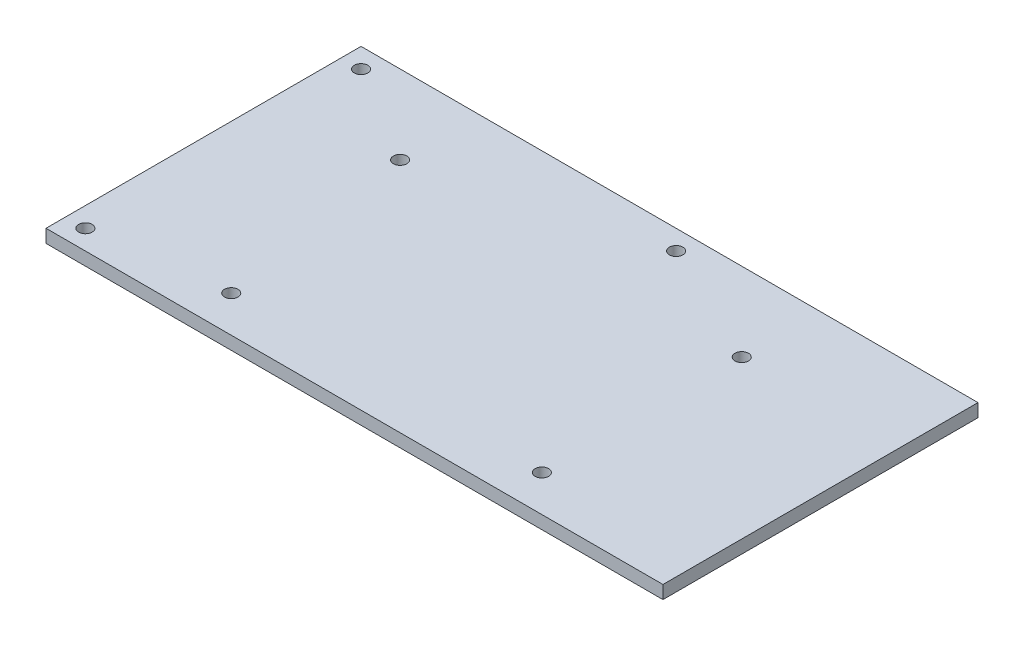
ISO-10303-21;
HEADER;
FILE_DESCRIPTION(('STEP AP214'),'2;1');
FILE_NAME('part.step','',(''),(''),'','','');
FILE_SCHEMA(('AUTOMOTIVE_DESIGN { 1 0 10303 214 1 1 1 1 }'));
ENDSEC;
DATA;
#1=APPLICATION_CONTEXT('core data for automotive mechanical design processes');
#2=APPLICATION_PROTOCOL_DEFINITION('international standard','automotive_design',2000,#1);
#3=PRODUCT_CONTEXT('',#1,'mechanical');
#4=PRODUCT('Part','Part','',(#3));
#5=PRODUCT_RELATED_PRODUCT_CATEGORY('part','',(#4));
#6=PRODUCT_DEFINITION_FORMATION('','',#4);
#7=PRODUCT_DEFINITION_CONTEXT('part definition',#1,'design');
#8=PRODUCT_DEFINITION('design','',#6,#7);
#9=PRODUCT_DEFINITION_SHAPE('','',#8);
#10=(LENGTH_UNIT() NAMED_UNIT(*) SI_UNIT(.MILLI.,.METRE.));
#11=(NAMED_UNIT(*) PLANE_ANGLE_UNIT() SI_UNIT($,.RADIAN.));
#12=(NAMED_UNIT(*) SI_UNIT($,.STERADIAN.) SOLID_ANGLE_UNIT());
#13=UNCERTAINTY_MEASURE_WITH_UNIT(LENGTH_MEASURE(1.E-05),#10,'distance_accuracy_value','');
#14=(GEOMETRIC_REPRESENTATION_CONTEXT(3) GLOBAL_UNCERTAINTY_ASSIGNED_CONTEXT((#13)) GLOBAL_UNIT_ASSIGNED_CONTEXT((#10,
#11,#12)) REPRESENTATION_CONTEXT('',''));
#15=CARTESIAN_POINT('',(0.,0.,0.));
#16=DIRECTION('',(0.,0.,1.));
#17=DIRECTION('',(1.,0.,0.));
#18=AXIS2_PLACEMENT_3D('',#15,#16,#17);
#19=CARTESIAN_POINT('',(74.6125,3.175,38.1));
#20=DIRECTION('',(-1.,0.,0.));
#21=DIRECTION('',(0.,0.,1.));
#22=AXIS2_PLACEMENT_3D('',#19,#20,#21);
#23=PLANE('',#22);
#24=DIRECTION('',(0.,0.,-1.));
#25=VECTOR('',#24,1.);
#26=CARTESIAN_POINT('',(74.6125,0.,38.1));
#27=LINE('',#26,#25);
#28=CARTESIAN_POINT('',(74.6125,0.,38.1));
#29=VERTEX_POINT('',#28);
#30=CARTESIAN_POINT('',(74.6125,0.,-38.1));
#31=VERTEX_POINT('',#30);
#32=EDGE_CURVE('E96',#29,#31,#27,.T.);
#33=ORIENTED_EDGE('',*,*,#32,.T.);
#34=DIRECTION('',(0.,-1.,0.));
#35=VECTOR('',#34,1.);
#36=CARTESIAN_POINT('',(74.6125,3.175,-38.1));
#37=LINE('',#36,#35);
#38=CARTESIAN_POINT('',(74.6125,3.175,-38.1));
#39=VERTEX_POINT('',#38);
#40=EDGE_CURVE('E11',#39,#31,#37,.T.);
#41=ORIENTED_EDGE('',*,*,#40,.F.);
#42=DIRECTION('',(0.,0.,-1.));
#43=VECTOR('',#42,1.);
#44=CARTESIAN_POINT('',(74.6125,3.175,38.1));
#45=LINE('',#44,#43);
#46=CARTESIAN_POINT('',(74.6125,3.175,38.1));
#47=VERTEX_POINT('',#46);
#48=EDGE_CURVE('E84',#47,#39,#45,.T.);
#49=ORIENTED_EDGE('',*,*,#48,.F.);
#50=DIRECTION('',(0.,-1.,0.));
#51=VECTOR('',#50,1.);
#52=CARTESIAN_POINT('',(74.6125,3.175,38.1));
#53=LINE('',#52,#51);
#54=EDGE_CURVE('E92',#47,#29,#53,.T.);
#55=ORIENTED_EDGE('',*,*,#54,.T.);
#56=EDGE_LOOP('',(#33,#41,#49,#55));
#57=FACE_BOUND('',#56,.T.);
#58=ADVANCED_FACE('F33',(#57),#23,.F.);
#59=CARTESIAN_POINT('',(-74.6125,3.175,-38.1));
#60=DIRECTION('',(0.,0.,1.));
#61=DIRECTION('',(1.,0.,0.));
#62=AXIS2_PLACEMENT_3D('',#59,#60,#61);
#63=PLANE('',#62);
#64=DIRECTION('',(-1.,0.,0.));
#65=VECTOR('',#64,1.);
#66=CARTESIAN_POINT('',(-74.6125,0.,-38.1));
#67=LINE('',#66,#65);
#68=CARTESIAN_POINT('',(-74.6125,0.,-38.1));
#69=VERTEX_POINT('',#68);
#70=EDGE_CURVE('E88',#31,#69,#67,.T.);
#71=ORIENTED_EDGE('',*,*,#70,.T.);
#72=DIRECTION('',(0.,-1.,0.));
#73=VECTOR('',#72,1.);
#74=CARTESIAN_POINT('',(-74.6125,3.175,-38.1));
#75=LINE('',#74,#73);
#76=CARTESIAN_POINT('',(-74.6125,3.175,-38.1));
#77=VERTEX_POINT('',#76);
#78=EDGE_CURVE('E41',#77,#69,#75,.T.);
#79=ORIENTED_EDGE('',*,*,#78,.F.);
#80=DIRECTION('',(-1.,0.,0.));
#81=VECTOR('',#80,1.);
#82=CARTESIAN_POINT('',(-74.6125,3.175,-38.1));
#83=LINE('',#82,#81);
#84=EDGE_CURVE('E79',#39,#77,#83,.T.);
#85=ORIENTED_EDGE('',*,*,#84,.F.);
#86=ORIENTED_EDGE('',*,*,#40,.T.);
#87=EDGE_LOOP('',(#71,#79,#85,#86));
#88=FACE_BOUND('',#87,.T.);
#89=ADVANCED_FACE('F87',(#88),#63,.F.);
#90=CARTESIAN_POINT('',(-74.6125,3.175,38.1));
#91=DIRECTION('',(1.,0.,0.));
#92=DIRECTION('',(0.,0.,-1.));
#93=AXIS2_PLACEMENT_3D('',#90,#91,#92);
#94=PLANE('',#93);
#95=DIRECTION('',(0.,0.,1.));
#96=VECTOR('',#95,1.);
#97=CARTESIAN_POINT('',(-74.6125,0.,38.1));
#98=LINE('',#97,#96);
#99=CARTESIAN_POINT('',(-74.6125,0.,38.1));
#100=VERTEX_POINT('',#99);
#101=EDGE_CURVE('E66',#69,#100,#98,.T.);
#102=ORIENTED_EDGE('',*,*,#101,.T.);
#103=DIRECTION('',(0.,-1.,0.));
#104=VECTOR('',#103,1.);
#105=CARTESIAN_POINT('',(-74.6125,3.175,38.1));
#106=LINE('',#105,#104);
#107=CARTESIAN_POINT('',(-74.6125,3.175,38.1));
#108=VERTEX_POINT('',#107);
#109=EDGE_CURVE('E89',#108,#100,#106,.T.);
#110=ORIENTED_EDGE('',*,*,#109,.F.);
#111=DIRECTION('',(0.,0.,1.));
#112=VECTOR('',#111,1.);
#113=CARTESIAN_POINT('',(-74.6125,3.175,38.1));
#114=LINE('',#113,#112);
#115=EDGE_CURVE('E82',#77,#108,#114,.T.);
#116=ORIENTED_EDGE('',*,*,#115,.F.);
#117=ORIENTED_EDGE('',*,*,#78,.T.);
#118=EDGE_LOOP('',(#102,#110,#116,#117));
#119=FACE_BOUND('',#118,.T.);
#120=ADVANCED_FACE('F90',(#119),#94,.F.);
#121=CARTESIAN_POINT('',(-74.6125,3.175,38.1));
#122=DIRECTION('',(0.,0.,-1.));
#123=DIRECTION('',(-1.,0.,0.));
#124=AXIS2_PLACEMENT_3D('',#121,#122,#123);
#125=PLANE('',#124);
#126=DIRECTION('',(1.,0.,0.));
#127=VECTOR('',#126,1.);
#128=CARTESIAN_POINT('',(-74.6125,0.,38.1));
#129=LINE('',#128,#127);
#130=EDGE_CURVE('E72',#100,#29,#129,.T.);
#131=ORIENTED_EDGE('',*,*,#130,.T.);
#132=ORIENTED_EDGE('',*,*,#54,.F.);
#133=DIRECTION('',(1.,0.,0.));
#134=VECTOR('',#133,1.);
#135=CARTESIAN_POINT('',(-74.6125,3.175,38.1));
#136=LINE('',#135,#134);
#137=EDGE_CURVE('E49',#108,#47,#136,.T.);
#138=ORIENTED_EDGE('',*,*,#137,.F.);
#139=ORIENTED_EDGE('',*,*,#109,.T.);
#140=EDGE_LOOP('',(#131,#132,#138,#139));
#141=FACE_BOUND('',#140,.T.);
#142=ADVANCED_FACE('F104',(#141),#125,.F.);
#143=CARTESIAN_POINT('',(0.,3.175,0.));
#144=DIRECTION('',(0.,-1.,0.));
#145=DIRECTION('',(0.,0.,-1.));
#146=AXIS2_PLACEMENT_3D('',#143,#144,#145);
#147=PLANE('',#146);
#148=CARTESIAN_POINT('',(36.5125,3.175,29.2862));
#149=DIRECTION('',(0.,1.,0.));
#150=DIRECTION('',(0.,0.,1.));
#151=AXIS2_PLACEMENT_3D('',#148,#149,#150);
#152=CIRCLE('',#151,1.63195);
#153=CARTESIAN_POINT('',(36.5125,3.175,30.91815));
#154=VERTEX_POINT('',#153);
#155=EDGE_CURVE('E143',#154,#154,#152,.T.);
#156=ORIENTED_EDGE('',*,*,#155,.F.);
#157=EDGE_LOOP('',(#156));
#158=FACE_BOUND('',#157,.T.);
#159=CARTESIAN_POINT('',(36.5125,3.175,-19.05));
#160=DIRECTION('',(0.,1.,0.));
#161=DIRECTION('',(0.,0.,1.));
#162=AXIS2_PLACEMENT_3D('',#159,#160,#161);
#163=CIRCLE('',#162,1.63195);
#164=CARTESIAN_POINT('',(36.5125,3.175,-17.41805));
#165=VERTEX_POINT('',#164);
#166=EDGE_CURVE('E137',#165,#165,#163,.T.);
#167=ORIENTED_EDGE('',*,*,#166,.F.);
#168=EDGE_LOOP('',(#167));
#169=FACE_BOUND('',#168,.T.);
#170=CARTESIAN_POINT('',(-38.6207,3.175,29.2862));
#171=DIRECTION('',(0.,1.,0.));
#172=DIRECTION('',(0.,0.,1.));
#173=AXIS2_PLACEMENT_3D('',#170,#171,#172);
#174=CIRCLE('',#173,1.63195);
#175=CARTESIAN_POINT('',(-38.6207,3.175,30.91815));
#176=VERTEX_POINT('',#175);
#177=EDGE_CURVE('E131',#176,#176,#174,.T.);
#178=ORIENTED_EDGE('',*,*,#177,.F.);
#179=EDGE_LOOP('',(#178));
#180=FACE_BOUND('',#179,.T.);
#181=CARTESIAN_POINT('',(-46.1137,3.175,-19.05));
#182=DIRECTION('',(0.,1.,0.));
#183=DIRECTION('',(0.,0.,1.));
#184=AXIS2_PLACEMENT_3D('',#181,#182,#183);
#185=CIRCLE('',#184,1.63195);
#186=CARTESIAN_POINT('',(-46.1137,3.175,-17.41805));
#187=VERTEX_POINT('',#186);
#188=EDGE_CURVE('E125',#187,#187,#185,.T.);
#189=ORIENTED_EDGE('',*,*,#188,.F.);
#190=EDGE_LOOP('',(#189));
#191=FACE_BOUND('',#190,.T.);
#192=CARTESIAN_POINT('',(6.34999999999995,3.175,-33.3375));
#193=DIRECTION('',(0.,1.,0.));
#194=DIRECTION('',(0.,0.,1.));
#195=AXIS2_PLACEMENT_3D('',#192,#193,#194);
#196=CIRCLE('',#195,1.63195);
#197=CARTESIAN_POINT('',(6.34999999999995,3.175,-31.70555));
#198=VERTEX_POINT('',#197);
#199=EDGE_CURVE('E119',#198,#198,#196,.T.);
#200=ORIENTED_EDGE('',*,*,#199,.F.);
#201=EDGE_LOOP('',(#200));
#202=FACE_BOUND('',#201,.T.);
#203=CARTESIAN_POINT('',(-69.85,3.175,33.3375));
#204=DIRECTION('',(0.,1.,0.));
#205=DIRECTION('',(0.,0.,1.));
#206=AXIS2_PLACEMENT_3D('',#203,#204,#205);
#207=CIRCLE('',#206,1.63194999999999);
#208=CARTESIAN_POINT('',(-69.85,3.175,34.96945));
#209=VERTEX_POINT('',#208);
#210=EDGE_CURVE('E113',#209,#209,#207,.T.);
#211=ORIENTED_EDGE('',*,*,#210,.F.);
#212=EDGE_LOOP('',(#211));
#213=FACE_BOUND('',#212,.T.);
#214=CARTESIAN_POINT('',(-69.85,3.175,-33.3375));
#215=DIRECTION('',(0.,1.,0.));
#216=DIRECTION('',(0.,0.,1.));
#217=AXIS2_PLACEMENT_3D('',#214,#215,#216);
#218=CIRCLE('',#217,1.63194999999999);
#219=CARTESIAN_POINT('',(-69.85,3.175,-31.70555));
#220=VERTEX_POINT('',#219);
#221=EDGE_CURVE('E99',#220,#220,#218,.T.);
#222=ORIENTED_EDGE('',*,*,#221,.F.);
#223=EDGE_LOOP('',(#222));
#224=FACE_BOUND('',#223,.T.);
#225=ORIENTED_EDGE('',*,*,#48,.T.);
#226=ORIENTED_EDGE('',*,*,#84,.T.);
#227=ORIENTED_EDGE('',*,*,#115,.T.);
#228=ORIENTED_EDGE('',*,*,#137,.T.);
#229=EDGE_LOOP('',(#225,#226,#227,#228));
#230=FACE_BOUND('',#229,.T.);
#231=ADVANCED_FACE('F80',(#158,#169,#180,#191,#202,#213,#224,#230),#147,.F.);
#232=CARTESIAN_POINT('',(0.,0.,0.));
#233=DIRECTION('',(0.,-1.,0.));
#234=DIRECTION('',(0.,0.,-1.));
#235=AXIS2_PLACEMENT_3D('',#232,#233,#234);
#236=PLANE('',#235);
#237=CARTESIAN_POINT('',(36.5125,0.,29.2862));
#238=DIRECTION('',(0.,-1.,0.));
#239=DIRECTION('',(0.,0.,-1.));
#240=AXIS2_PLACEMENT_3D('',#237,#238,#239);
#241=CIRCLE('',#240,1.63195);
#242=CARTESIAN_POINT('',(36.5125,0.,27.65425));
#243=VERTEX_POINT('',#242);
#244=EDGE_CURVE('E146',#243,#243,#241,.F.);
#245=ORIENTED_EDGE('',*,*,#244,.T.);
#246=EDGE_LOOP('',(#245));
#247=FACE_BOUND('',#246,.T.);
#248=CARTESIAN_POINT('',(36.5125,0.,-19.05));
#249=DIRECTION('',(0.,-1.,0.));
#250=DIRECTION('',(0.,0.,-1.));
#251=AXIS2_PLACEMENT_3D('',#248,#249,#250);
#252=CIRCLE('',#251,1.63195);
#253=CARTESIAN_POINT('',(36.5125,0.,-20.68195));
#254=VERTEX_POINT('',#253);
#255=EDGE_CURVE('E140',#254,#254,#252,.F.);
#256=ORIENTED_EDGE('',*,*,#255,.T.);
#257=EDGE_LOOP('',(#256));
#258=FACE_BOUND('',#257,.T.);
#259=CARTESIAN_POINT('',(-38.6207,0.,29.2862));
#260=DIRECTION('',(0.,-1.,0.));
#261=DIRECTION('',(0.,0.,-1.));
#262=AXIS2_PLACEMENT_3D('',#259,#260,#261);
#263=CIRCLE('',#262,1.63195);
#264=CARTESIAN_POINT('',(-38.6207,0.,27.65425));
#265=VERTEX_POINT('',#264);
#266=EDGE_CURVE('E134',#265,#265,#263,.F.);
#267=ORIENTED_EDGE('',*,*,#266,.T.);
#268=EDGE_LOOP('',(#267));
#269=FACE_BOUND('',#268,.T.);
#270=CARTESIAN_POINT('',(-46.1137,0.,-19.05));
#271=DIRECTION('',(0.,-1.,0.));
#272=DIRECTION('',(0.,0.,-1.));
#273=AXIS2_PLACEMENT_3D('',#270,#271,#272);
#274=CIRCLE('',#273,1.63195);
#275=CARTESIAN_POINT('',(-46.1137,0.,-20.68195));
#276=VERTEX_POINT('',#275);
#277=EDGE_CURVE('E128',#276,#276,#274,.F.);
#278=ORIENTED_EDGE('',*,*,#277,.T.);
#279=EDGE_LOOP('',(#278));
#280=FACE_BOUND('',#279,.T.);
#281=CARTESIAN_POINT('',(6.34999999999995,0.,-33.3375));
#282=DIRECTION('',(0.,-1.,0.));
#283=DIRECTION('',(0.,0.,-1.));
#284=AXIS2_PLACEMENT_3D('',#281,#282,#283);
#285=CIRCLE('',#284,1.63195);
#286=CARTESIAN_POINT('',(6.34999999999995,0.,-34.96945));
#287=VERTEX_POINT('',#286);
#288=EDGE_CURVE('E122',#287,#287,#285,.F.);
#289=ORIENTED_EDGE('',*,*,#288,.T.);
#290=EDGE_LOOP('',(#289));
#291=FACE_BOUND('',#290,.T.);
#292=CARTESIAN_POINT('',(-69.85,0.,33.3375));
#293=DIRECTION('',(0.,-1.,0.));
#294=DIRECTION('',(0.,0.,-1.));
#295=AXIS2_PLACEMENT_3D('',#292,#293,#294);
#296=CIRCLE('',#295,1.63194999999999);
#297=CARTESIAN_POINT('',(-69.85,0.,31.70555));
#298=VERTEX_POINT('',#297);
#299=EDGE_CURVE('E116',#298,#298,#296,.F.);
#300=ORIENTED_EDGE('',*,*,#299,.T.);
#301=EDGE_LOOP('',(#300));
#302=FACE_BOUND('',#301,.T.);
#303=CARTESIAN_POINT('',(-69.85,0.,-33.3375));
#304=DIRECTION('',(0.,-1.,0.));
#305=DIRECTION('',(0.,0.,-1.));
#306=AXIS2_PLACEMENT_3D('',#303,#304,#305);
#307=CIRCLE('',#306,1.63194999999999);
#308=CARTESIAN_POINT('',(-69.85,0.,-34.96945));
#309=VERTEX_POINT('',#308);
#310=EDGE_CURVE('E110',#309,#309,#307,.F.);
#311=ORIENTED_EDGE('',*,*,#310,.T.);
#312=EDGE_LOOP('',(#311));
#313=FACE_BOUND('',#312,.T.);
#314=ORIENTED_EDGE('',*,*,#32,.F.);
#315=ORIENTED_EDGE('',*,*,#130,.F.);
#316=ORIENTED_EDGE('',*,*,#101,.F.);
#317=ORIENTED_EDGE('',*,*,#70,.F.);
#318=EDGE_LOOP('',(#314,#315,#316,#317));
#319=FACE_BOUND('',#318,.T.);
#320=ADVANCED_FACE('F107',(#247,#258,#269,#280,#291,#302,#313,#319),#236,.T.);
#321=CARTESIAN_POINT('',(-69.85,-0.00100000000000013,-33.3375));
#322=DIRECTION('',(0.,1.,0.));
#323=DIRECTION('',(0.,0.,1.));
#324=AXIS2_PLACEMENT_3D('',#321,#322,#323);
#325=CYLINDRICAL_SURFACE('',#324,1.63194999999999);
#326=ORIENTED_EDGE('',*,*,#310,.F.);
#327=EDGE_LOOP('',(#326));
#328=FACE_BOUND('',#327,.T.);
#329=ORIENTED_EDGE('',*,*,#221,.T.);
#330=EDGE_LOOP('',(#329));
#331=FACE_BOUND('',#330,.T.);
#332=ADVANCED_FACE('F169',(#328,#331),#325,.F.);
#333=CARTESIAN_POINT('',(-69.85,-0.00100000000000013,33.3375));
#334=DIRECTION('',(0.,1.,0.));
#335=DIRECTION('',(0.,0.,1.));
#336=AXIS2_PLACEMENT_3D('',#333,#334,#335);
#337=CYLINDRICAL_SURFACE('',#336,1.63194999999999);
#338=ORIENTED_EDGE('',*,*,#299,.F.);
#339=EDGE_LOOP('',(#338));
#340=FACE_BOUND('',#339,.T.);
#341=ORIENTED_EDGE('',*,*,#210,.T.);
#342=EDGE_LOOP('',(#341));
#343=FACE_BOUND('',#342,.T.);
#344=ADVANCED_FACE('F171',(#340,#343),#337,.F.);
#345=CARTESIAN_POINT('',(6.34999999999995,-0.00100000000000013,-33.3375));
#346=DIRECTION('',(0.,1.,0.));
#347=DIRECTION('',(0.,0.,1.));
#348=AXIS2_PLACEMENT_3D('',#345,#346,#347);
#349=CYLINDRICAL_SURFACE('',#348,1.63195);
#350=ORIENTED_EDGE('',*,*,#288,.F.);
#351=EDGE_LOOP('',(#350));
#352=FACE_BOUND('',#351,.T.);
#353=ORIENTED_EDGE('',*,*,#199,.T.);
#354=EDGE_LOOP('',(#353));
#355=FACE_BOUND('',#354,.T.);
#356=ADVANCED_FACE('F178',(#352,#355),#349,.F.);
#357=CARTESIAN_POINT('',(-46.1137,-0.00100000000000013,-19.05));
#358=DIRECTION('',(0.,1.,0.));
#359=DIRECTION('',(0.,0.,1.));
#360=AXIS2_PLACEMENT_3D('',#357,#358,#359);
#361=CYLINDRICAL_SURFACE('',#360,1.63195);
#362=ORIENTED_EDGE('',*,*,#277,.F.);
#363=EDGE_LOOP('',(#362));
#364=FACE_BOUND('',#363,.T.);
#365=ORIENTED_EDGE('',*,*,#188,.T.);
#366=EDGE_LOOP('',(#365));
#367=FACE_BOUND('',#366,.T.);
#368=ADVANCED_FACE('F213',(#364,#367),#361,.F.);
#369=CARTESIAN_POINT('',(-38.6207,-0.00100000000000013,29.2862));
#370=DIRECTION('',(0.,1.,0.));
#371=DIRECTION('',(0.,0.,1.));
#372=AXIS2_PLACEMENT_3D('',#369,#370,#371);
#373=CYLINDRICAL_SURFACE('',#372,1.63195);
#374=ORIENTED_EDGE('',*,*,#266,.F.);
#375=EDGE_LOOP('',(#374));
#376=FACE_BOUND('',#375,.T.);
#377=ORIENTED_EDGE('',*,*,#177,.T.);
#378=EDGE_LOOP('',(#377));
#379=FACE_BOUND('',#378,.T.);
#380=ADVANCED_FACE('F218',(#376,#379),#373,.F.);
#381=CARTESIAN_POINT('',(36.5125,-0.00100000000000013,-19.05));
#382=DIRECTION('',(0.,1.,0.));
#383=DIRECTION('',(0.,0.,1.));
#384=AXIS2_PLACEMENT_3D('',#381,#382,#383);
#385=CYLINDRICAL_SURFACE('',#384,1.63195);
#386=ORIENTED_EDGE('',*,*,#255,.F.);
#387=EDGE_LOOP('',(#386));
#388=FACE_BOUND('',#387,.T.);
#389=ORIENTED_EDGE('',*,*,#166,.T.);
#390=EDGE_LOOP('',(#389));
#391=FACE_BOUND('',#390,.T.);
#392=ADVANCED_FACE('F230',(#388,#391),#385,.F.);
#393=CARTESIAN_POINT('',(36.5125,-0.00100000000000013,29.2862));
#394=DIRECTION('',(0.,1.,0.));
#395=DIRECTION('',(0.,0.,1.));
#396=AXIS2_PLACEMENT_3D('',#393,#394,#395);
#397=CYLINDRICAL_SURFACE('',#396,1.63195);
#398=ORIENTED_EDGE('',*,*,#244,.F.);
#399=EDGE_LOOP('',(#398));
#400=FACE_BOUND('',#399,.T.);
#401=ORIENTED_EDGE('',*,*,#155,.T.);
#402=EDGE_LOOP('',(#401));
#403=FACE_BOUND('',#402,.T.);
#404=ADVANCED_FACE('F152',(#400,#403),#397,.F.);
#405=CLOSED_SHELL('',(#58,#89,#120,#142,#231,#320,#332,#344,#356,#368,#380,#392,#404));
#406=MANIFOLD_SOLID_BREP('B2',#405);
#407=ADVANCED_BREP_SHAPE_REPRESENTATION('',(#18,#406),#14);
#408=SHAPE_DEFINITION_REPRESENTATION(#9,#407);
ENDSEC;
END-ISO-10303-21;
